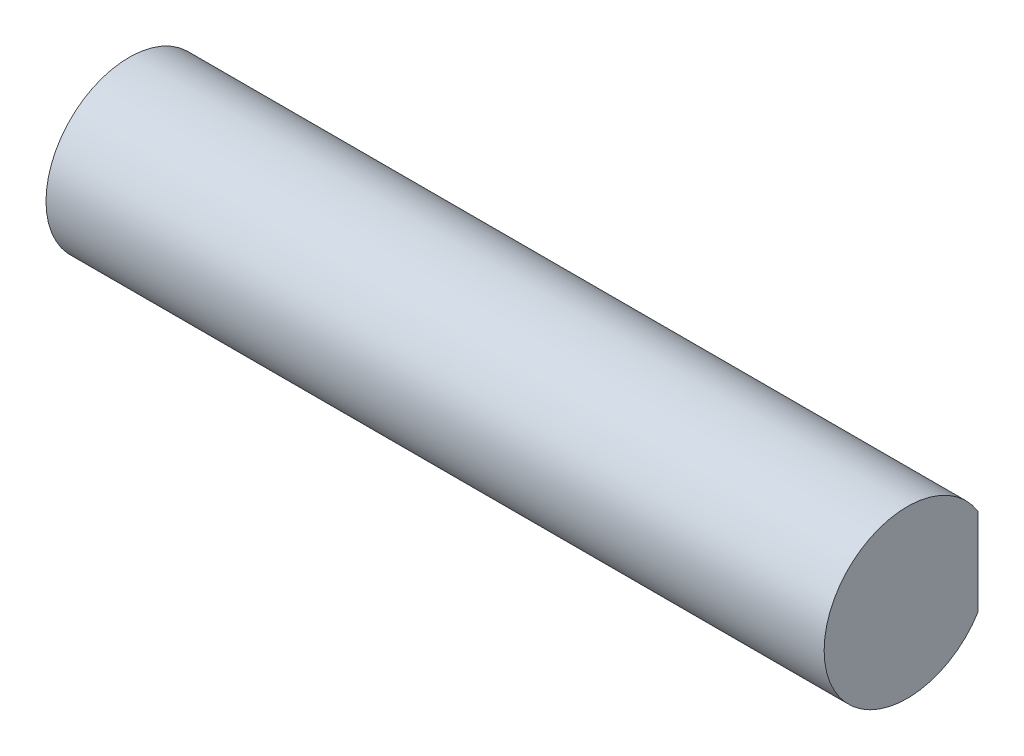
ISO-10303-21;
HEADER;
FILE_DESCRIPTION(('STEP AP214'),'2;1');
FILE_NAME('part.step','',(''),(''),'','','');
FILE_SCHEMA(('AUTOMOTIVE_DESIGN { 1 0 10303 214 1 1 1 1 }'));
ENDSEC;
DATA;
#1=APPLICATION_CONTEXT('core data for automotive mechanical design processes');
#2=APPLICATION_PROTOCOL_DEFINITION('international standard','automotive_design',2000,#1);
#3=PRODUCT_CONTEXT('',#1,'mechanical');
#4=PRODUCT('Part','Part','',(#3));
#5=PRODUCT_RELATED_PRODUCT_CATEGORY('part','',(#4));
#6=PRODUCT_DEFINITION_FORMATION('','',#4);
#7=PRODUCT_DEFINITION_CONTEXT('part definition',#1,'design');
#8=PRODUCT_DEFINITION('design','',#6,#7);
#9=PRODUCT_DEFINITION_SHAPE('','',#8);
#10=(LENGTH_UNIT() NAMED_UNIT(*) SI_UNIT(.MILLI.,.METRE.));
#11=(NAMED_UNIT(*) PLANE_ANGLE_UNIT() SI_UNIT($,.RADIAN.));
#12=(NAMED_UNIT(*) SI_UNIT($,.STERADIAN.) SOLID_ANGLE_UNIT());
#13=UNCERTAINTY_MEASURE_WITH_UNIT(LENGTH_MEASURE(1.E-05),#10,'distance_accuracy_value','');
#14=(GEOMETRIC_REPRESENTATION_CONTEXT(3) GLOBAL_UNCERTAINTY_ASSIGNED_CONTEXT((#13)) GLOBAL_UNIT_ASSIGNED_CONTEXT((#10,
#11,#12)) REPRESENTATION_CONTEXT('',''));
#15=CARTESIAN_POINT('',(0.,0.,0.));
#16=DIRECTION('',(0.,0.,1.));
#17=DIRECTION('',(1.,0.,0.));
#18=AXIS2_PLACEMENT_3D('',#15,#16,#17);
#19=CARTESIAN_POINT('',(22.,0.,0.));
#20=DIRECTION('',(-1.,0.,0.));
#21=DIRECTION('',(0.,0.,1.));
#22=AXIS2_PLACEMENT_3D('',#19,#20,#21);
#23=CYLINDRICAL_SURFACE('',#22,2.35);
#24=CARTESIAN_POINT('',(22.,0.,0.));
#25=DIRECTION('',(1.,0.,0.));
#26=DIRECTION('',(0.,0.,-1.));
#27=AXIS2_PLACEMENT_3D('',#24,#25,#26);
#28=CIRCLE('',#27,2.35);
#29=CARTESIAN_POINT('',(22.,1.23389626792531,-2.));
#30=VERTEX_POINT('',#29);
#31=CARTESIAN_POINT('',(22.,-1.23389626792531,-2.));
#32=VERTEX_POINT('',#31);
#33=EDGE_CURVE('E11',#30,#32,#28,.T.);
#34=ORIENTED_EDGE('',*,*,#33,.F.);
#35=DIRECTION('',(-1.,0.,0.));
#36=VECTOR('',#35,1.);
#37=CARTESIAN_POINT('',(24.4924887161229,1.23389626792531,-2.));
#38=LINE('',#37,#36);
#39=CARTESIAN_POINT('',(0.,1.23389626792531,-2.));
#40=VERTEX_POINT('',#39);
#41=EDGE_CURVE('E59',#30,#40,#38,.T.);
#42=ORIENTED_EDGE('',*,*,#41,.T.);
#43=CARTESIAN_POINT('',(0.,0.,0.));
#44=DIRECTION('',(1.,0.,0.));
#45=DIRECTION('',(0.,0.,-1.));
#46=AXIS2_PLACEMENT_3D('',#43,#44,#45);
#47=CIRCLE('',#46,2.35);
#48=CARTESIAN_POINT('',(0.,-1.23389626792531,-2.));
#49=VERTEX_POINT('',#48);
#50=EDGE_CURVE('E39',#40,#49,#47,.T.);
#51=ORIENTED_EDGE('',*,*,#50,.T.);
#52=DIRECTION('',(-1.,0.,0.));
#53=VECTOR('',#52,1.);
#54=CARTESIAN_POINT('',(24.4924887161229,-1.23389626792531,-2.));
#55=LINE('',#54,#53);
#56=EDGE_CURVE('E50',#32,#49,#55,.T.);
#57=ORIENTED_EDGE('',*,*,#56,.F.);
#58=EDGE_LOOP('',(#34,#42,#51,#57));
#59=FACE_BOUND('',#58,.T.);
#60=ADVANCED_FACE('F36',(#59),#23,.T.);
#61=CARTESIAN_POINT('',(22.,0.,0.));
#62=DIRECTION('',(1.,0.,0.));
#63=DIRECTION('',(0.,0.,-1.));
#64=AXIS2_PLACEMENT_3D('',#61,#62,#63);
#65=PLANE('',#64);
#66=DIRECTION('',(0.,1.,0.));
#67=VECTOR('',#66,1.);
#68=CARTESIAN_POINT('',(22.,1.23389626792531,-2.));
#69=LINE('',#68,#67);
#70=EDGE_CURVE('E62',#32,#30,#69,.T.);
#71=ORIENTED_EDGE('',*,*,#70,.T.);
#72=ORIENTED_EDGE('',*,*,#33,.T.);
#73=EDGE_LOOP('',(#71,#72));
#74=FACE_BOUND('',#73,.T.);
#75=ADVANCED_FACE('F69',(#74),#65,.T.);
#76=CARTESIAN_POINT('',(0.,0.,0.));
#77=DIRECTION('',(1.,0.,0.));
#78=DIRECTION('',(0.,0.,-1.));
#79=AXIS2_PLACEMENT_3D('',#76,#77,#78);
#80=PLANE('',#79);
#81=ORIENTED_EDGE('',*,*,#50,.F.);
#82=DIRECTION('',(0.,1.,0.));
#83=VECTOR('',#82,1.);
#84=CARTESIAN_POINT('',(0.,1.23389626792531,-2.));
#85=LINE('',#84,#83);
#86=EDGE_CURVE('E55',#49,#40,#85,.T.);
#87=ORIENTED_EDGE('',*,*,#86,.F.);
#88=EDGE_LOOP('',(#81,#87));
#89=FACE_BOUND('',#88,.T.);
#90=ADVANCED_FACE('F74',(#89),#80,.F.);
#91=CARTESIAN_POINT('',(24.4924887161229,1.23389626792531,-2.));
#92=DIRECTION('',(0.,0.,1.));
#93=DIRECTION('',(1.,0.,0.));
#94=AXIS2_PLACEMENT_3D('',#91,#92,#93);
#95=PLANE('',#94);
#96=ORIENTED_EDGE('',*,*,#56,.T.);
#97=ORIENTED_EDGE('',*,*,#86,.T.);
#98=ORIENTED_EDGE('',*,*,#41,.F.);
#99=ORIENTED_EDGE('',*,*,#70,.F.);
#100=EDGE_LOOP('',(#96,#97,#98,#99));
#101=FACE_BOUND('',#100,.T.);
#102=ADVANCED_FACE('F61',(#101),#95,.F.);
#103=CLOSED_SHELL('',(#60,#75,#90,#102));
#104=MANIFOLD_SOLID_BREP('B2',#103);
#105=ADVANCED_BREP_SHAPE_REPRESENTATION('',(#18,#104),#14);
#106=SHAPE_DEFINITION_REPRESENTATION(#9,#105);
ENDSEC;
END-ISO-10303-21;
